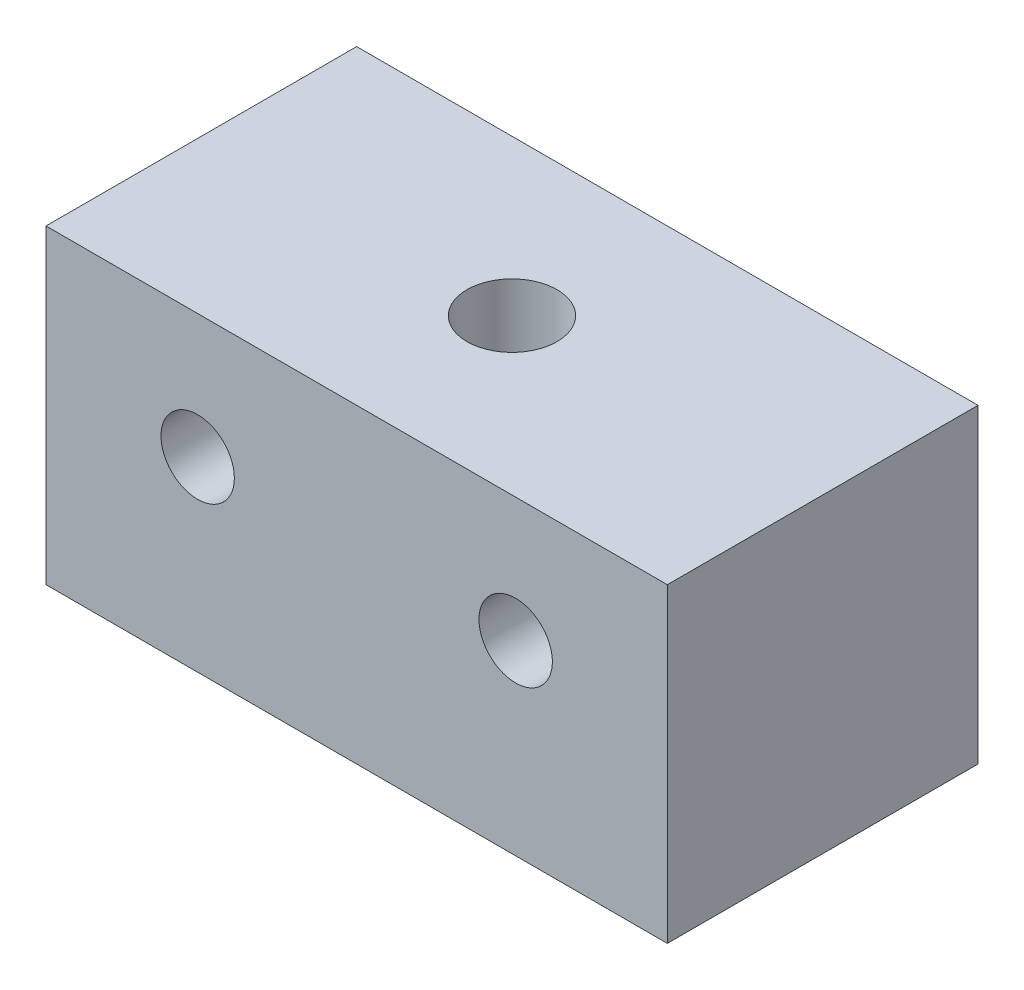
ISO-10303-21;
HEADER;
FILE_DESCRIPTION(('STEP AP214'),'2;1');
FILE_NAME('part.step','',(''),(''),'','','');
FILE_SCHEMA(('AUTOMOTIVE_DESIGN { 1 0 10303 214 1 1 1 1 }'));
ENDSEC;
DATA;
#1=APPLICATION_CONTEXT('core data for automotive mechanical design processes');
#2=APPLICATION_PROTOCOL_DEFINITION('international standard','automotive_design',2000,#1);
#3=PRODUCT_CONTEXT('',#1,'mechanical');
#4=PRODUCT('Part','Part','',(#3));
#5=PRODUCT_RELATED_PRODUCT_CATEGORY('part','',(#4));
#6=PRODUCT_DEFINITION_FORMATION('','',#4);
#7=PRODUCT_DEFINITION_CONTEXT('part definition',#1,'design');
#8=PRODUCT_DEFINITION('design','',#6,#7);
#9=PRODUCT_DEFINITION_SHAPE('','',#8);
#10=(LENGTH_UNIT() NAMED_UNIT(*) SI_UNIT(.MILLI.,.METRE.));
#11=(NAMED_UNIT(*) PLANE_ANGLE_UNIT() SI_UNIT($,.RADIAN.));
#12=(NAMED_UNIT(*) SI_UNIT($,.STERADIAN.) SOLID_ANGLE_UNIT());
#13=UNCERTAINTY_MEASURE_WITH_UNIT(LENGTH_MEASURE(1.E-05),#10,'distance_accuracy_value','');
#14=(GEOMETRIC_REPRESENTATION_CONTEXT(3) GLOBAL_UNCERTAINTY_ASSIGNED_CONTEXT((#13)) GLOBAL_UNIT_ASSIGNED_CONTEXT((#10,
#11,#12)) REPRESENTATION_CONTEXT('',''));
#15=CARTESIAN_POINT('',(0.,0.,0.));
#16=DIRECTION('',(0.,0.,1.));
#17=DIRECTION('',(1.,0.,0.));
#18=AXIS2_PLACEMENT_3D('',#15,#16,#17);
#19=CARTESIAN_POINT('',(0.,12.7,0.));
#20=DIRECTION('',(1.,0.,0.));
#21=DIRECTION('',(0.,0.,-1.));
#22=AXIS2_PLACEMENT_3D('',#19,#20,#21);
#23=PLANE('',#22);
#24=DIRECTION('',(0.,0.,1.));
#25=VECTOR('',#24,1.);
#26=CARTESIAN_POINT('',(0.,0.,0.));
#27=LINE('',#26,#25);
#28=CARTESIAN_POINT('',(0.,0.,-12.7));
#29=VERTEX_POINT('',#28);
#30=CARTESIAN_POINT('',(0.,0.,0.));
#31=VERTEX_POINT('',#30);
#32=EDGE_CURVE('E96',#29,#31,#27,.T.);
#33=ORIENTED_EDGE('',*,*,#32,.T.);
#34=DIRECTION('',(0.,-1.,0.));
#35=VECTOR('',#34,1.);
#36=CARTESIAN_POINT('',(0.,12.7,0.));
#37=LINE('',#36,#35);
#38=CARTESIAN_POINT('',(0.,12.7,0.));
#39=VERTEX_POINT('',#38);
#40=EDGE_CURVE('E11',#39,#31,#37,.T.);
#41=ORIENTED_EDGE('',*,*,#40,.F.);
#42=DIRECTION('',(0.,0.,1.));
#43=VECTOR('',#42,1.);
#44=CARTESIAN_POINT('',(0.,12.7,0.));
#45=LINE('',#44,#43);
#46=CARTESIAN_POINT('',(0.,12.7,-12.7));
#47=VERTEX_POINT('',#46);
#48=EDGE_CURVE('E84',#47,#39,#45,.T.);
#49=ORIENTED_EDGE('',*,*,#48,.F.);
#50=DIRECTION('',(0.,-1.,0.));
#51=VECTOR('',#50,1.);
#52=CARTESIAN_POINT('',(0.,12.7,-12.7));
#53=LINE('',#52,#51);
#54=EDGE_CURVE('E92',#47,#29,#53,.T.);
#55=ORIENTED_EDGE('',*,*,#54,.T.);
#56=EDGE_LOOP('',(#33,#41,#49,#55));
#57=FACE_BOUND('',#56,.T.);
#58=ADVANCED_FACE('F33',(#57),#23,.F.);
#59=CARTESIAN_POINT('',(0.,12.7,0.));
#60=DIRECTION('',(0.,0.,-1.));
#61=DIRECTION('',(-1.,0.,0.));
#62=AXIS2_PLACEMENT_3D('',#59,#60,#61);
#63=PLANE('',#62);
#64=CARTESIAN_POINT('',(19.2,7.62,0.));
#65=DIRECTION('',(0.,0.,1.));
#66=DIRECTION('',(-1.,0.,0.));
#67=AXIS2_PLACEMENT_3D('',#64,#65,#66);
#68=CIRCLE('',#67,1.5);
#69=CARTESIAN_POINT('',(17.7,7.62,0.));
#70=VERTEX_POINT('',#69);
#71=EDGE_CURVE('E117',#70,#70,#68,.T.);
#72=ORIENTED_EDGE('',*,*,#71,.F.);
#73=EDGE_LOOP('',(#72));
#74=FACE_BOUND('',#73,.T.);
#75=CARTESIAN_POINT('',(6.2,7.62,0.));
#76=DIRECTION('',(0.,0.,1.));
#77=DIRECTION('',(1.,0.,0.));
#78=AXIS2_PLACEMENT_3D('',#75,#76,#77);
#79=CIRCLE('',#78,1.5);
#80=CARTESIAN_POINT('',(7.7,7.62,0.));
#81=VERTEX_POINT('',#80);
#82=EDGE_CURVE('E110',#81,#81,#79,.T.);
#83=ORIENTED_EDGE('',*,*,#82,.F.);
#84=EDGE_LOOP('',(#83));
#85=FACE_BOUND('',#84,.T.);
#86=DIRECTION('',(1.,0.,0.));
#87=VECTOR('',#86,1.);
#88=CARTESIAN_POINT('',(0.,0.,0.));
#89=LINE('',#88,#87);
#90=CARTESIAN_POINT('',(25.4,0.,0.));
#91=VERTEX_POINT('',#90);
#92=EDGE_CURVE('E88',#31,#91,#89,.T.);
#93=ORIENTED_EDGE('',*,*,#92,.T.);
#94=DIRECTION('',(0.,-1.,0.));
#95=VECTOR('',#94,1.);
#96=CARTESIAN_POINT('',(25.4,12.7,0.));
#97=LINE('',#96,#95);
#98=CARTESIAN_POINT('',(25.4,12.7,0.));
#99=VERTEX_POINT('',#98);
#100=EDGE_CURVE('E41',#99,#91,#97,.T.);
#101=ORIENTED_EDGE('',*,*,#100,.F.);
#102=DIRECTION('',(1.,0.,0.));
#103=VECTOR('',#102,1.);
#104=CARTESIAN_POINT('',(0.,12.7,0.));
#105=LINE('',#104,#103);
#106=EDGE_CURVE('E79',#39,#99,#105,.T.);
#107=ORIENTED_EDGE('',*,*,#106,.F.);
#108=ORIENTED_EDGE('',*,*,#40,.T.);
#109=EDGE_LOOP('',(#93,#101,#107,#108));
#110=FACE_BOUND('',#109,.T.);
#111=ADVANCED_FACE('F87',(#74,#85,#110),#63,.F.);
#112=CARTESIAN_POINT('',(25.4,12.7,0.));
#113=DIRECTION('',(-1.,0.,0.));
#114=DIRECTION('',(0.,0.,1.));
#115=AXIS2_PLACEMENT_3D('',#112,#113,#114);
#116=PLANE('',#115);
#117=DIRECTION('',(0.,0.,-1.));
#118=VECTOR('',#117,1.);
#119=CARTESIAN_POINT('',(25.4,0.,0.));
#120=LINE('',#119,#118);
#121=CARTESIAN_POINT('',(25.4,0.,-12.7));
#122=VERTEX_POINT('',#121);
#123=EDGE_CURVE('E66',#91,#122,#120,.T.);
#124=ORIENTED_EDGE('',*,*,#123,.T.);
#125=DIRECTION('',(0.,-1.,0.));
#126=VECTOR('',#125,1.);
#127=CARTESIAN_POINT('',(25.4,12.7,-12.7));
#128=LINE('',#127,#126);
#129=CARTESIAN_POINT('',(25.4,12.7,-12.7));
#130=VERTEX_POINT('',#129);
#131=EDGE_CURVE('E89',#130,#122,#128,.T.);
#132=ORIENTED_EDGE('',*,*,#131,.F.);
#133=DIRECTION('',(0.,0.,-1.));
#134=VECTOR('',#133,1.);
#135=CARTESIAN_POINT('',(25.4,12.7,0.));
#136=LINE('',#135,#134);
#137=EDGE_CURVE('E82',#99,#130,#136,.T.);
#138=ORIENTED_EDGE('',*,*,#137,.F.);
#139=ORIENTED_EDGE('',*,*,#100,.T.);
#140=EDGE_LOOP('',(#124,#132,#138,#139));
#141=FACE_BOUND('',#140,.T.);
#142=ADVANCED_FACE('F90',(#141),#116,.F.);
#143=CARTESIAN_POINT('',(0.,12.7,-12.7));
#144=DIRECTION('',(0.,0.,1.));
#145=DIRECTION('',(1.,0.,0.));
#146=AXIS2_PLACEMENT_3D('',#143,#144,#145);
#147=PLANE('',#146);
#148=CARTESIAN_POINT('',(19.2,7.62,-12.7));
#149=DIRECTION('',(0.,0.,1.));
#150=DIRECTION('',(-1.,0.,0.));
#151=AXIS2_PLACEMENT_3D('',#148,#149,#150);
#152=CIRCLE('',#151,1.5);
#153=CARTESIAN_POINT('',(17.7,7.62,-12.7));
#154=VERTEX_POINT('',#153);
#155=EDGE_CURVE('E99',#154,#154,#152,.T.);
#156=ORIENTED_EDGE('',*,*,#155,.T.);
#157=EDGE_LOOP('',(#156));
#158=FACE_BOUND('',#157,.T.);
#159=CARTESIAN_POINT('',(6.2,7.62,-12.7));
#160=DIRECTION('',(0.,0.,1.));
#161=DIRECTION('',(1.,0.,0.));
#162=AXIS2_PLACEMENT_3D('',#159,#160,#161);
#163=CIRCLE('',#162,1.5);
#164=CARTESIAN_POINT('',(7.7,7.62,-12.7));
#165=VERTEX_POINT('',#164);
#166=EDGE_CURVE('E113',#165,#165,#163,.T.);
#167=ORIENTED_EDGE('',*,*,#166,.T.);
#168=EDGE_LOOP('',(#167));
#169=FACE_BOUND('',#168,.T.);
#170=DIRECTION('',(-1.,0.,0.));
#171=VECTOR('',#170,1.);
#172=CARTESIAN_POINT('',(0.,0.,-12.7));
#173=LINE('',#172,#171);
#174=EDGE_CURVE('E72',#122,#29,#173,.T.);
#175=ORIENTED_EDGE('',*,*,#174,.T.);
#176=ORIENTED_EDGE('',*,*,#54,.F.);
#177=DIRECTION('',(-1.,0.,0.));
#178=VECTOR('',#177,1.);
#179=CARTESIAN_POINT('',(0.,12.7,-12.7));
#180=LINE('',#179,#178);
#181=EDGE_CURVE('E49',#130,#47,#180,.T.);
#182=ORIENTED_EDGE('',*,*,#181,.F.);
#183=ORIENTED_EDGE('',*,*,#131,.T.);
#184=EDGE_LOOP('',(#175,#176,#182,#183));
#185=FACE_BOUND('',#184,.T.);
#186=ADVANCED_FACE('F104',(#158,#169,#185),#147,.F.);
#187=CARTESIAN_POINT('',(0.,12.7,0.));
#188=DIRECTION('',(0.,-1.,0.));
#189=DIRECTION('',(0.,0.,-1.));
#190=AXIS2_PLACEMENT_3D('',#187,#188,#189);
#191=PLANE('',#190);
#192=CARTESIAN_POINT('',(12.7,12.7,-6.35));
#193=DIRECTION('',(0.,1.,0.));
#194=DIRECTION('',(0.,0.,1.));
#195=AXIS2_PLACEMENT_3D('',#192,#193,#194);
#196=CIRCLE('',#195,1.8415);
#197=CARTESIAN_POINT('',(12.7,12.7,-4.5085));
#198=VERTEX_POINT('',#197);
#199=EDGE_CURVE('E122',#198,#198,#196,.T.);
#200=ORIENTED_EDGE('',*,*,#199,.F.);
#201=EDGE_LOOP('',(#200));
#202=FACE_BOUND('',#201,.T.);
#203=ORIENTED_EDGE('',*,*,#48,.T.);
#204=ORIENTED_EDGE('',*,*,#106,.T.);
#205=ORIENTED_EDGE('',*,*,#137,.T.);
#206=ORIENTED_EDGE('',*,*,#181,.T.);
#207=EDGE_LOOP('',(#203,#204,#205,#206));
#208=FACE_BOUND('',#207,.T.);
#209=ADVANCED_FACE('F80',(#202,#208),#191,.F.);
#210=CARTESIAN_POINT('',(0.,0.,0.));
#211=DIRECTION('',(0.,-1.,0.));
#212=DIRECTION('',(0.,0.,-1.));
#213=AXIS2_PLACEMENT_3D('',#210,#211,#212);
#214=PLANE('',#213);
#215=CARTESIAN_POINT('',(12.7,0.,-6.35));
#216=DIRECTION('',(0.,1.,0.));
#217=DIRECTION('',(0.,0.,1.));
#218=AXIS2_PLACEMENT_3D('',#215,#216,#217);
#219=CIRCLE('',#218,1.8415);
#220=CARTESIAN_POINT('',(12.7,0.,-4.5085));
#221=VERTEX_POINT('',#220);
#222=EDGE_CURVE('E114',#221,#221,#219,.T.);
#223=ORIENTED_EDGE('',*,*,#222,.T.);
#224=EDGE_LOOP('',(#223));
#225=FACE_BOUND('',#224,.T.);
#226=ORIENTED_EDGE('',*,*,#32,.F.);
#227=ORIENTED_EDGE('',*,*,#174,.F.);
#228=ORIENTED_EDGE('',*,*,#123,.F.);
#229=ORIENTED_EDGE('',*,*,#92,.F.);
#230=EDGE_LOOP('',(#226,#227,#228,#229));
#231=FACE_BOUND('',#230,.T.);
#232=ADVANCED_FACE('F107',(#225,#231),#214,.T.);
#233=CARTESIAN_POINT('',(6.2,7.62,-12.7));
#234=DIRECTION('',(0.,0.,1.));
#235=DIRECTION('',(1.,0.,0.));
#236=AXIS2_PLACEMENT_3D('',#233,#234,#235);
#237=CYLINDRICAL_SURFACE('',#236,1.5);
#238=ORIENTED_EDGE('',*,*,#166,.F.);
#239=EDGE_LOOP('',(#238));
#240=FACE_BOUND('',#239,.T.);
#241=ORIENTED_EDGE('',*,*,#82,.T.);
#242=EDGE_LOOP('',(#241));
#243=FACE_BOUND('',#242,.T.);
#244=ADVANCED_FACE('F142',(#240,#243),#237,.F.);
#245=CARTESIAN_POINT('',(19.2,7.62,-12.7));
#246=DIRECTION('',(0.,0.,1.));
#247=DIRECTION('',(1.,0.,0.));
#248=AXIS2_PLACEMENT_3D('',#245,#246,#247);
#249=CYLINDRICAL_SURFACE('',#248,1.5);
#250=ORIENTED_EDGE('',*,*,#155,.F.);
#251=EDGE_LOOP('',(#250));
#252=FACE_BOUND('',#251,.T.);
#253=ORIENTED_EDGE('',*,*,#71,.T.);
#254=EDGE_LOOP('',(#253));
#255=FACE_BOUND('',#254,.T.);
#256=ADVANCED_FACE('F132',(#252,#255),#249,.F.);
#257=CARTESIAN_POINT('',(12.7,0.,-6.35));
#258=DIRECTION('',(0.,1.,0.));
#259=DIRECTION('',(0.,0.,1.));
#260=AXIS2_PLACEMENT_3D('',#257,#258,#259);
#261=CYLINDRICAL_SURFACE('',#260,1.8415);
#262=ORIENTED_EDGE('',*,*,#222,.F.);
#263=EDGE_LOOP('',(#262));
#264=FACE_BOUND('',#263,.T.);
#265=ORIENTED_EDGE('',*,*,#199,.T.);
#266=EDGE_LOOP('',(#265));
#267=FACE_BOUND('',#266,.T.);
#268=ADVANCED_FACE('F129',(#264,#267),#261,.F.);
#269=CLOSED_SHELL('',(#58,#111,#142,#186,#209,#232,#244,#256,#268));
#270=MANIFOLD_SOLID_BREP('B2',#269);
#271=ADVANCED_BREP_SHAPE_REPRESENTATION('',(#18,#270),#14);
#272=SHAPE_DEFINITION_REPRESENTATION(#9,#271);
ENDSEC;
END-ISO-10303-21;
